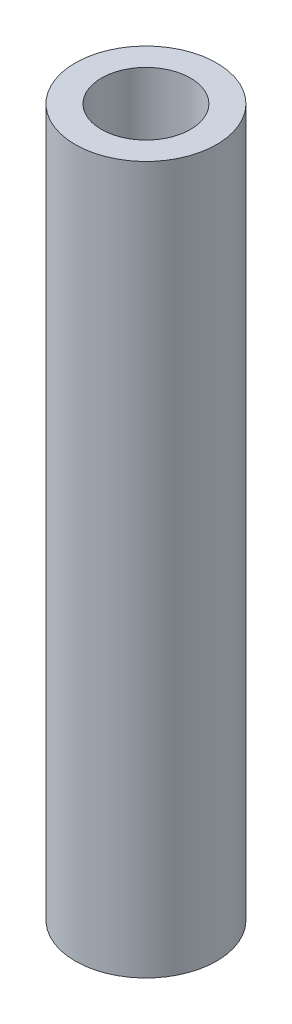
ISO-10303-21;
HEADER;
FILE_DESCRIPTION(('STEP AP214'),'2;1');
FILE_NAME('part.step','',(''),(''),'','','');
FILE_SCHEMA(('AUTOMOTIVE_DESIGN { 1 0 10303 214 1 1 1 1 }'));
ENDSEC;
DATA;
#1=APPLICATION_CONTEXT('core data for automotive mechanical design processes');
#2=APPLICATION_PROTOCOL_DEFINITION('international standard','automotive_design',2000,#1);
#3=PRODUCT_CONTEXT('',#1,'mechanical');
#4=PRODUCT('Part','Part','',(#3));
#5=PRODUCT_RELATED_PRODUCT_CATEGORY('part','',(#4));
#6=PRODUCT_DEFINITION_FORMATION('','',#4);
#7=PRODUCT_DEFINITION_CONTEXT('part definition',#1,'design');
#8=PRODUCT_DEFINITION('design','',#6,#7);
#9=PRODUCT_DEFINITION_SHAPE('','',#8);
#10=(LENGTH_UNIT() NAMED_UNIT(*) SI_UNIT(.MILLI.,.METRE.));
#11=(NAMED_UNIT(*) PLANE_ANGLE_UNIT() SI_UNIT($,.RADIAN.));
#12=(NAMED_UNIT(*) SI_UNIT($,.STERADIAN.) SOLID_ANGLE_UNIT());
#13=UNCERTAINTY_MEASURE_WITH_UNIT(LENGTH_MEASURE(1.E-05),#10,'distance_accuracy_value','');
#14=(GEOMETRIC_REPRESENTATION_CONTEXT(3) GLOBAL_UNCERTAINTY_ASSIGNED_CONTEXT((#13)) GLOBAL_UNIT_ASSIGNED_CONTEXT((#10,
#11,#12)) REPRESENTATION_CONTEXT('',''));
#15=CARTESIAN_POINT('',(0.,0.,0.));
#16=DIRECTION('',(0.,0.,1.));
#17=DIRECTION('',(1.,0.,0.));
#18=AXIS2_PLACEMENT_3D('',#15,#16,#17);
#19=CARTESIAN_POINT('',(0.,31.75,0.));
#20=DIRECTION('',(0.,1.,0.));
#21=DIRECTION('',(0.,0.,1.));
#22=AXIS2_PLACEMENT_3D('',#19,#20,#21);
#23=PLANE('',#22);
#24=CARTESIAN_POINT('',(0.,31.75,0.));
#25=DIRECTION('',(0.,1.,0.));
#26=DIRECTION('',(0.,0.,1.));
#27=AXIS2_PLACEMENT_3D('',#24,#25,#26);
#28=CIRCLE('',#27,3.175);
#29=CARTESIAN_POINT('',(0.,31.75,3.175));
#30=VERTEX_POINT('',#29);
#31=EDGE_CURVE('E10',#30,#30,#28,.T.);
#32=ORIENTED_EDGE('',*,*,#31,.T.);
#33=EDGE_LOOP('',(#32));
#34=FACE_BOUND('',#33,.T.);
#35=CARTESIAN_POINT('',(0.,31.75,0.));
#36=DIRECTION('',(0.,1.,0.));
#37=DIRECTION('',(0.,0.,1.));
#38=AXIS2_PLACEMENT_3D('',#35,#36,#37);
#39=CIRCLE('',#38,2.);
#40=CARTESIAN_POINT('',(0.,31.75,2.));
#41=VERTEX_POINT('',#40);
#42=EDGE_CURVE('E50',#41,#41,#39,.T.);
#43=ORIENTED_EDGE('',*,*,#42,.F.);
#44=EDGE_LOOP('',(#43));
#45=FACE_BOUND('',#44,.T.);
#46=ADVANCED_FACE('F37',(#34,#45),#23,.T.);
#47=CARTESIAN_POINT('',(0.,0.,0.));
#48=DIRECTION('',(0.,1.,0.));
#49=DIRECTION('',(0.,0.,1.));
#50=AXIS2_PLACEMENT_3D('',#47,#48,#49);
#51=PLANE('',#50);
#52=CARTESIAN_POINT('',(0.,0.,0.));
#53=DIRECTION('',(0.,1.,0.));
#54=DIRECTION('',(0.,0.,1.));
#55=AXIS2_PLACEMENT_3D('',#52,#53,#54);
#56=CIRCLE('',#55,3.175);
#57=CARTESIAN_POINT('',(0.,0.,3.175));
#58=VERTEX_POINT('',#57);
#59=EDGE_CURVE('E41',#58,#58,#56,.T.);
#60=ORIENTED_EDGE('',*,*,#59,.F.);
#61=EDGE_LOOP('',(#60));
#62=FACE_BOUND('',#61,.T.);
#63=CARTESIAN_POINT('',(0.,0.,0.));
#64=DIRECTION('',(0.,1.,0.));
#65=DIRECTION('',(0.,0.,1.));
#66=AXIS2_PLACEMENT_3D('',#63,#64,#65);
#67=CIRCLE('',#66,2.);
#68=CARTESIAN_POINT('',(0.,0.,2.));
#69=VERTEX_POINT('',#68);
#70=EDGE_CURVE('E52',#69,#69,#67,.T.);
#71=ORIENTED_EDGE('',*,*,#70,.T.);
#72=EDGE_LOOP('',(#71));
#73=FACE_BOUND('',#72,.T.);
#74=ADVANCED_FACE('F64',(#62,#73),#51,.F.);
#75=CARTESIAN_POINT('',(0.,31.75,0.));
#76=DIRECTION('',(0.,-1.,0.));
#77=DIRECTION('',(0.,0.,-1.));
#78=AXIS2_PLACEMENT_3D('',#75,#76,#77);
#79=CYLINDRICAL_SURFACE('',#78,3.175);
#80=ORIENTED_EDGE('',*,*,#31,.F.);
#81=EDGE_LOOP('',(#80));
#82=FACE_BOUND('',#81,.T.);
#83=ORIENTED_EDGE('',*,*,#59,.T.);
#84=EDGE_LOOP('',(#83));
#85=FACE_BOUND('',#84,.T.);
#86=ADVANCED_FACE('F39',(#82,#85),#79,.T.);
#87=CARTESIAN_POINT('',(0.,31.75,0.));
#88=DIRECTION('',(0.,-1.,0.));
#89=DIRECTION('',(0.,0.,-1.));
#90=AXIS2_PLACEMENT_3D('',#87,#88,#89);
#91=CYLINDRICAL_SURFACE('',#90,2.);
#92=ORIENTED_EDGE('',*,*,#42,.T.);
#93=EDGE_LOOP('',(#92));
#94=FACE_BOUND('',#93,.T.);
#95=ORIENTED_EDGE('',*,*,#70,.F.);
#96=EDGE_LOOP('',(#95));
#97=FACE_BOUND('',#96,.T.);
#98=ADVANCED_FACE('F60',(#94,#97),#91,.F.);
#99=CLOSED_SHELL('',(#46,#74,#86,#98));
#100=MANIFOLD_SOLID_BREP('B2',#99);
#101=ADVANCED_BREP_SHAPE_REPRESENTATION('',(#18,#100),#14);
#102=SHAPE_DEFINITION_REPRESENTATION(#9,#101);
ENDSEC;
END-ISO-10303-21;
